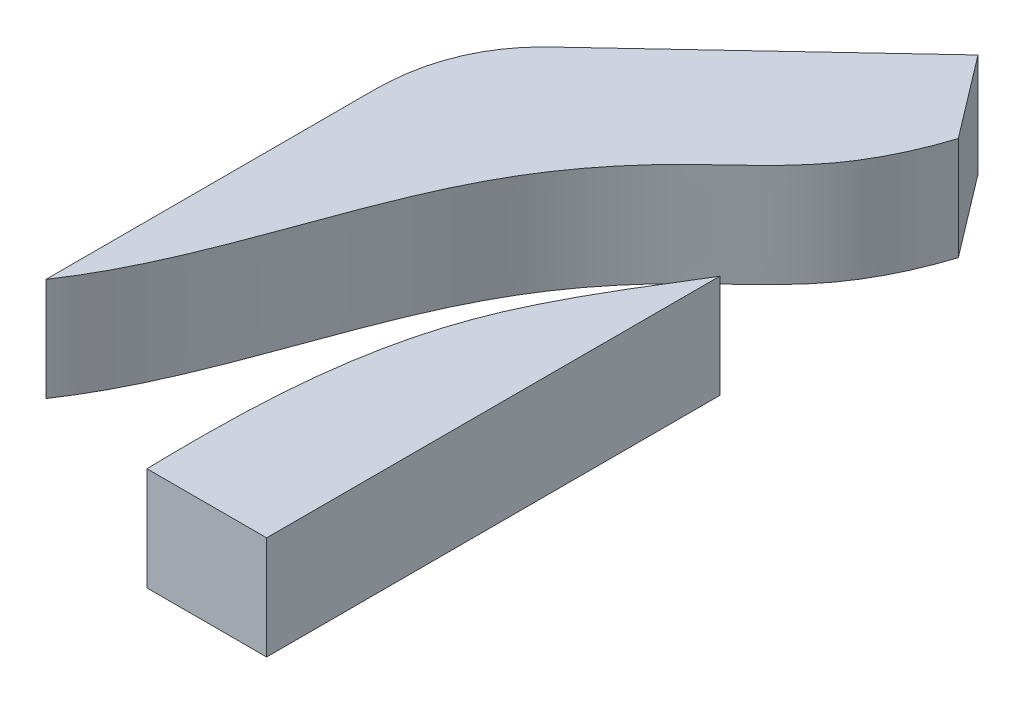
ISO-10303-21;
HEADER;
FILE_DESCRIPTION(('STEP AP214'),'2;1');
FILE_NAME('part.step','',(''),(''),'','','');
FILE_SCHEMA(('AUTOMOTIVE_DESIGN { 1 0 10303 214 1 1 1 1 }'));
ENDSEC;
DATA;
#1=APPLICATION_CONTEXT('core data for automotive mechanical design processes');
#2=APPLICATION_PROTOCOL_DEFINITION('international standard','automotive_design',2000,#1);
#3=PRODUCT_CONTEXT('',#1,'mechanical');
#4=PRODUCT('Part','Part','',(#3));
#5=PRODUCT_RELATED_PRODUCT_CATEGORY('part','',(#4));
#6=PRODUCT_DEFINITION_FORMATION('','',#4);
#7=PRODUCT_DEFINITION_CONTEXT('part definition',#1,'design');
#8=PRODUCT_DEFINITION('design','',#6,#7);
#9=PRODUCT_DEFINITION_SHAPE('','',#8);
#10=(LENGTH_UNIT() NAMED_UNIT(*) SI_UNIT(.MILLI.,.METRE.));
#11=(NAMED_UNIT(*) PLANE_ANGLE_UNIT() SI_UNIT($,.RADIAN.));
#12=(NAMED_UNIT(*) SI_UNIT($,.STERADIAN.) SOLID_ANGLE_UNIT());
#13=UNCERTAINTY_MEASURE_WITH_UNIT(LENGTH_MEASURE(1.E-05),#10,'distance_accuracy_value','');
#14=(GEOMETRIC_REPRESENTATION_CONTEXT(3) GLOBAL_UNCERTAINTY_ASSIGNED_CONTEXT((#13)) GLOBAL_UNIT_ASSIGNED_CONTEXT((#10,
#11,#12)) REPRESENTATION_CONTEXT('',''));
#15=CARTESIAN_POINT('',(0.,0.,0.));
#16=DIRECTION('',(0.,0.,1.));
#17=DIRECTION('',(1.,0.,0.));
#18=AXIS2_PLACEMENT_3D('',#15,#16,#17);
#19=CARTESIAN_POINT('',(5.43347693708701,10.,16.1487002459388));
#20=CARTESIAN_POINT('',(2.44808963674048,10.,21.0311807748737));
#21=CARTESIAN_POINT('',(-6.09922419084622,10.,34.2629090273488));
#22=CARTESIAN_POINT('',(-6.36319319711296,10.,50.6579436667892));
#23=CARTESIAN_POINT('',(-6.1594063001425,10.,60.0382290208681));
#24=B_SPLINE_CURVE_WITH_KNOTS('',3,(#19,#20,#21,#22,#23),.UNSPECIFIED.,.F.,.F.,(4,1,4),(0.,
0.373828803189006,1.),.UNSPECIFIED.);
#25=DIRECTION('',(0.,-1.,0.));
#26=VECTOR('',#25,1.);
#27=SURFACE_OF_LINEAR_EXTRUSION('',#24,#26);
#28=CARTESIAN_POINT('',(5.43347693708701,0.,16.1487002459388));
#29=CARTESIAN_POINT('',(2.44808963674048,0.,21.0311807748737));
#30=CARTESIAN_POINT('',(-6.09922419084622,0.,34.2629090273488));
#31=CARTESIAN_POINT('',(-6.36319319711296,0.,50.6579436667892));
#32=CARTESIAN_POINT('',(-6.1594063001425,0.,60.0382290208681));
#33=B_SPLINE_CURVE_WITH_KNOTS('',3,(#28,#29,#30,#31,#32),.UNSPECIFIED.,.F.,.F.,(4,1,4),(0.,
0.373828803189006,1.),.UNSPECIFIED.);
#34=CARTESIAN_POINT('',(5.43347693708701,0.,16.1487002459388));
#35=VERTEX_POINT('',#34);
#36=CARTESIAN_POINT('',(-6.1594063001425,0.,60.0382290208681));
#37=VERTEX_POINT('',#36);
#38=EDGE_CURVE('E90',#35,#37,#33,.T.);
#39=ORIENTED_EDGE('',*,*,#38,.T.);
#40=DIRECTION('',(0.,-1.,0.));
#41=VECTOR('',#40,1.);
#42=CARTESIAN_POINT('',(-6.1594063001425,10.,60.0382290208681));
#43=LINE('',#42,#41);
#44=CARTESIAN_POINT('',(-6.1594063001425,10.,60.0382290208681));
#45=VERTEX_POINT('',#44);
#46=EDGE_CURVE('E12',#45,#37,#43,.T.);
#47=ORIENTED_EDGE('',*,*,#46,.F.);
#48=CARTESIAN_POINT('',(5.43347693708701,10.,16.1487002459388));
#49=VERTEX_POINT('',#48);
#50=EDGE_CURVE('E85',#49,#45,#24,.T.);
#51=ORIENTED_EDGE('',*,*,#50,.F.);
#52=DIRECTION('',(0.,-1.,0.));
#53=VECTOR('',#52,1.);
#54=CARTESIAN_POINT('',(5.43347693708701,10.,16.1487002459388));
#55=LINE('',#54,#53);
#56=EDGE_CURVE('E91',#49,#35,#55,.T.);
#57=ORIENTED_EDGE('',*,*,#56,.T.);
#58=EDGE_LOOP('',(#39,#47,#51,#57));
#59=FACE_BOUND('',#58,.T.);
#60=ADVANCED_FACE('F43',(#59),#27,.F.);
#61=CARTESIAN_POINT('',(-6.1594063001425,10.,60.0382290208681));
#62=DIRECTION('',(0.,0.,-1.));
#63=DIRECTION('',(-1.,0.,0.));
#64=AXIS2_PLACEMENT_3D('',#61,#62,#63);
#65=PLANE('',#64);
#66=DIRECTION('',(1.,0.,0.));
#67=VECTOR('',#66,1.);
#68=CARTESIAN_POINT('',(-6.1594063001425,0.,60.0382290208681));
#69=LINE('',#68,#67);
#70=CARTESIAN_POINT('',(5.43347693708702,0.,60.0382290208681));
#71=VERTEX_POINT('',#70);
#72=EDGE_CURVE('E92',#37,#71,#69,.T.);
#73=ORIENTED_EDGE('',*,*,#72,.T.);
#74=DIRECTION('',(0.,-1.,0.));
#75=VECTOR('',#74,1.);
#76=CARTESIAN_POINT('',(5.43347693708702,10.,60.0382290208681));
#77=LINE('',#76,#75);
#78=CARTESIAN_POINT('',(5.43347693708702,10.,60.0382290208681));
#79=VERTEX_POINT('',#78);
#80=EDGE_CURVE('E52',#79,#71,#77,.T.);
#81=ORIENTED_EDGE('',*,*,#80,.F.);
#82=DIRECTION('',(1.,0.,0.));
#83=VECTOR('',#82,1.);
#84=CARTESIAN_POINT('',(-6.1594063001425,10.,60.0382290208681));
#85=LINE('',#84,#83);
#86=EDGE_CURVE('E81',#45,#79,#85,.T.);
#87=ORIENTED_EDGE('',*,*,#86,.F.);
#88=ORIENTED_EDGE('',*,*,#46,.T.);
#89=EDGE_LOOP('',(#73,#81,#87,#88));
#90=FACE_BOUND('',#89,.T.);
#91=ADVANCED_FACE('F82',(#90),#65,.F.);
#92=CARTESIAN_POINT('',(5.43347693708701,10.,16.1487002459388));
#93=DIRECTION('',(-1.,0.,0.));
#94=DIRECTION('',(0.,0.,1.));
#95=AXIS2_PLACEMENT_3D('',#92,#93,#94);
#96=PLANE('',#95);
#97=DIRECTION('',(0.,0.,-1.));
#98=VECTOR('',#97,1.);
#99=CARTESIAN_POINT('',(5.43347693708701,0.,16.1487002459388));
#100=LINE('',#99,#98);
#101=EDGE_CURVE('E73',#71,#35,#100,.T.);
#102=ORIENTED_EDGE('',*,*,#101,.T.);
#103=ORIENTED_EDGE('',*,*,#56,.F.);
#104=DIRECTION('',(0.,0.,-1.));
#105=VECTOR('',#104,1.);
#106=CARTESIAN_POINT('',(5.43347693708702,10.,60.0382290208681));
#107=LINE('',#106,#105);
#108=EDGE_CURVE('E60',#79,#49,#107,.T.);
#109=ORIENTED_EDGE('',*,*,#108,.F.);
#110=ORIENTED_EDGE('',*,*,#80,.T.);
#111=EDGE_LOOP('',(#102,#103,#109,#110));
#112=FACE_BOUND('',#111,.T.);
#113=ADVANCED_FACE('F103',(#112),#96,.F.);
#114=CARTESIAN_POINT('',(-4.47593978036184,10.,36.9557213571783));
#115=DIRECTION('',(0.,1.,0.));
#116=DIRECTION('',(0.,0.,1.));
#117=AXIS2_PLACEMENT_3D('',#114,#115,#116);
#118=PLANE('',#117);
#119=ORIENTED_EDGE('',*,*,#50,.T.);
#120=ORIENTED_EDGE('',*,*,#86,.T.);
#121=ORIENTED_EDGE('',*,*,#108,.T.);
#122=EDGE_LOOP('',(#119,#120,#121));
#123=FACE_BOUND('',#122,.T.);
#124=ADVANCED_FACE('F88',(#123),#118,.T.);
#125=CARTESIAN_POINT('',(-4.47593978036184,0.,36.9557213571783));
#126=DIRECTION('',(0.,1.,0.));
#127=DIRECTION('',(0.,0.,1.));
#128=AXIS2_PLACEMENT_3D('',#125,#126,#127);
#129=PLANE('',#128);
#130=ORIENTED_EDGE('',*,*,#38,.F.);
#131=ORIENTED_EDGE('',*,*,#101,.F.);
#132=ORIENTED_EDGE('',*,*,#72,.F.);
#133=EDGE_LOOP('',(#130,#131,#132));
#134=FACE_BOUND('',#133,.T.);
#135=ADVANCED_FACE('F110',(#134),#129,.F.);
#136=CLOSED_SHELL('',(#60,#91,#113,#124,#135));
#137=MANIFOLD_SOLID_BREP('B2',#136);
#138=CARTESIAN_POINT('',(-0.618053813941455,10.,-14.9156518952457));
#139=DIRECTION('',(0.683862883392565,0.,0.7296105514026));
#140=DIRECTION('',(0.7296105514026,0.,-0.683862883392565));
#141=AXIS2_PLACEMENT_3D('',#138,#139,#140);
#142=PLANE('',#141);
#143=DIRECTION('',(-0.7296105514026,0.,0.683862883392565));
#144=VECTOR('',#143,1.);
#145=CARTESIAN_POINT('',(-0.618053813941455,0.,-14.9156518952457));
#146=LINE('',#145,#144);
#147=CARTESIAN_POINT('',(-0.618053813941455,0.,-14.9156518952457));
#148=VERTEX_POINT('',#147);
#149=CARTESIAN_POINT('',(-21.6096220002586,0.,4.75971370799269));
#150=VERTEX_POINT('',#149);
#151=EDGE_CURVE('E265',#148,#150,#146,.T.);
#152=ORIENTED_EDGE('',*,*,#151,.T.);
#153=DIRECTION('',(0.,-1.,0.));
#154=VECTOR('',#153,1.);
#155=CARTESIAN_POINT('',(-21.6096220002586,10.,4.75971370799269));
#156=LINE('',#155,#154);
#157=CARTESIAN_POINT('',(-21.6096220002586,10.,4.75971370799269));
#158=VERTEX_POINT('',#157);
#159=EDGE_CURVE('E41',#158,#150,#156,.T.);
#160=ORIENTED_EDGE('',*,*,#159,.F.);
#161=DIRECTION('',(-0.7296105514026,0.,0.683862883392565));
#162=VECTOR('',#161,1.);
#163=CARTESIAN_POINT('',(-0.618053813941455,10.,-14.9156518952457));
#164=LINE('',#163,#162);
#165=CARTESIAN_POINT('',(-0.618053813941455,10.,-14.9156518952457));
#166=VERTEX_POINT('',#165);
#167=EDGE_CURVE('E248',#166,#158,#164,.T.);
#168=ORIENTED_EDGE('',*,*,#167,.F.);
#169=DIRECTION('',(0.,-1.,0.));
#170=VECTOR('',#169,1.);
#171=CARTESIAN_POINT('',(-0.618053813941455,10.,-14.9156518952457));
#172=LINE('',#171,#170);
#173=EDGE_CURVE('E225',#166,#148,#172,.T.);
#174=ORIENTED_EDGE('',*,*,#173,.T.);
#175=EDGE_LOOP('',(#152,#160,#168,#174));
#176=FACE_BOUND('',#175,.T.);
#177=ADVANCED_FACE('F155',(#176),#142,.F.);
#178=CARTESIAN_POINT('',(-21.6096220002586,10.,4.75971370799269));
#179=CARTESIAN_POINT('',(-26.8359828181968,10.,9.42662947041356));
#180=CARTESIAN_POINT('',(-26.9344284356281,10.,17.0455743500859));
#181=B_SPLINE_CURVE_WITH_KNOTS('',2,(#178,#179,#180),.UNSPECIFIED.,.F.,.F.,(3,3),(0.,1.),.UNSPECIFIED.);
#182=DIRECTION('',(0.,-1.,0.));
#183=VECTOR('',#182,1.);
#184=SURFACE_OF_LINEAR_EXTRUSION('',#181,#183);
#185=CARTESIAN_POINT('',(-21.6096220002586,0.,4.75971370799269));
#186=CARTESIAN_POINT('',(-26.8359828181968,0.,9.42662947041356));
#187=CARTESIAN_POINT('',(-26.9344284356281,0.,17.0455743500859));
#188=B_SPLINE_CURVE_WITH_KNOTS('',2,(#185,#186,#187),.UNSPECIFIED.,.F.,.F.,(3,3),(0.,1.),.UNSPECIFIED.);
#189=CARTESIAN_POINT('',(-26.9344284356281,0.,17.0455743500859));
#190=VERTEX_POINT('',#189);
#191=EDGE_CURVE('E264',#150,#190,#188,.T.);
#192=ORIENTED_EDGE('',*,*,#191,.T.);
#193=DIRECTION('',(0.,-1.,0.));
#194=VECTOR('',#193,1.);
#195=CARTESIAN_POINT('',(-26.9344284356281,10.,17.0455743500859));
#196=LINE('',#195,#194);
#197=CARTESIAN_POINT('',(-26.9344284356281,10.,17.0455743500859));
#198=VERTEX_POINT('',#197);
#199=EDGE_CURVE('E163',#198,#190,#196,.T.);
#200=ORIENTED_EDGE('',*,*,#199,.F.);
#201=EDGE_CURVE('E205',#158,#198,#181,.T.);
#202=ORIENTED_EDGE('',*,*,#201,.F.);
#203=ORIENTED_EDGE('',*,*,#159,.T.);
#204=EDGE_LOOP('',(#192,#200,#202,#203));
#205=FACE_BOUND('',#204,.T.);
#206=ADVANCED_FACE('F242',(#205),#184,.F.);
#207=CARTESIAN_POINT('',(-26.9344284356281,10.,17.0455743500859));
#208=DIRECTION('',(1.,0.,0.));
#209=DIRECTION('',(0.,0.,-1.));
#210=AXIS2_PLACEMENT_3D('',#207,#208,#209);
#211=PLANE('',#210);
#212=DIRECTION('',(0.,0.,1.));
#213=VECTOR('',#212,1.);
#214=CARTESIAN_POINT('',(-26.9344284356281,0.,17.0455743500859));
#215=LINE('',#214,#213);
#216=CARTESIAN_POINT('',(-26.9344284356281,0.,49.0403598017012));
#217=VERTEX_POINT('',#216);
#218=EDGE_CURVE('E220',#190,#217,#215,.T.);
#219=ORIENTED_EDGE('',*,*,#218,.T.);
#220=DIRECTION('',(0.,-1.,0.));
#221=VECTOR('',#220,1.);
#222=CARTESIAN_POINT('',(-26.9344284356281,10.,49.0403598017012));
#223=LINE('',#222,#221);
#224=CARTESIAN_POINT('',(-26.9344284356281,10.,49.0403598017012));
#225=VERTEX_POINT('',#224);
#226=EDGE_CURVE('E217',#225,#217,#223,.T.);
#227=ORIENTED_EDGE('',*,*,#226,.F.);
#228=DIRECTION('',(0.,0.,1.));
#229=VECTOR('',#228,1.);
#230=CARTESIAN_POINT('',(-26.9344284356281,10.,17.0455743500859));
#231=LINE('',#230,#229);
#232=EDGE_CURVE('E209',#198,#225,#231,.T.);
#233=ORIENTED_EDGE('',*,*,#232,.F.);
#234=ORIENTED_EDGE('',*,*,#199,.T.);
#235=EDGE_LOOP('',(#219,#227,#233,#234));
#236=FACE_BOUND('',#235,.T.);
#237=ADVANCED_FACE('F218',(#236),#211,.F.);
#238=CARTESIAN_POINT('',(-26.9344284356281,10.,49.0403598017012));
#239=CARTESIAN_POINT('',(-20.3389444877994,10.,39.2670595151407));
#240=CARTESIAN_POINT('',(-18.0784329925562,10.,23.4099198548988));
#241=CARTESIAN_POINT('',(-6.32022440820383,10.,8.59213540569394));
#242=CARTESIAN_POINT('',(1.62343273114423,10.,2.17339689320808));
#243=CARTESIAN_POINT('',(4.50466003243867,10.,-4.05678622613597));
#244=CARTESIAN_POINT('',(5.43347693708701,10.,-6.9545605398248));
#245=B_SPLINE_CURVE_WITH_KNOTS('',3,(#238,#239,#240,#241,#242,#243,#244),.UNSPECIFIED.,.F.,.F.,
(4,1,1,1,4),(0.,0.537381328145061,0.694322963995333,0.859001823298654,1.),.UNSPECIFIED.);
#246=DIRECTION('',(0.,-1.,0.));
#247=VECTOR('',#246,1.);
#248=SURFACE_OF_LINEAR_EXTRUSION('',#245,#247);
#249=CARTESIAN_POINT('',(-26.9344284356281,0.,49.0403598017012));
#250=CARTESIAN_POINT('',(-20.3389444877994,0.,39.2670595151407));
#251=CARTESIAN_POINT('',(-18.0784329925562,0.,23.4099198548988));
#252=CARTESIAN_POINT('',(-6.32022440820383,0.,8.59213540569394));
#253=CARTESIAN_POINT('',(1.62343273114423,0.,2.17339689320808));
#254=CARTESIAN_POINT('',(4.50466003243867,0.,-4.05678622613597));
#255=CARTESIAN_POINT('',(5.43347693708701,0.,-6.9545605398248));
#256=B_SPLINE_CURVE_WITH_KNOTS('',3,(#249,#250,#251,#252,#253,#254,#255),.UNSPECIFIED.,.F.,.F.,
(4,1,1,1,4),(0.,0.537381328145061,0.694322963995333,0.859001823298654,1.),.UNSPECIFIED.);
#257=CARTESIAN_POINT('',(5.43347693708701,0.,-6.9545605398248));
#258=VERTEX_POINT('',#257);
#259=EDGE_CURVE('E191',#217,#258,#256,.T.);
#260=ORIENTED_EDGE('',*,*,#259,.T.);
#261=DIRECTION('',(0.,-1.,0.));
#262=VECTOR('',#261,1.);
#263=CARTESIAN_POINT('',(5.43347693708701,10.,-6.9545605398248));
#264=LINE('',#263,#262);
#265=CARTESIAN_POINT('',(5.43347693708701,10.,-6.9545605398248));
#266=VERTEX_POINT('',#265);
#267=EDGE_CURVE('E221',#266,#258,#264,.T.);
#268=ORIENTED_EDGE('',*,*,#267,.F.);
#269=EDGE_CURVE('E213',#225,#266,#245,.T.);
#270=ORIENTED_EDGE('',*,*,#269,.F.);
#271=ORIENTED_EDGE('',*,*,#226,.T.);
#272=EDGE_LOOP('',(#260,#268,#270,#271));
#273=FACE_BOUND('',#272,.T.);
#274=ADVANCED_FACE('F223',(#273),#248,.F.);
#275=CARTESIAN_POINT('',(5.43347693708701,10.,-6.9545605398248));
#276=DIRECTION('',(-0.796109135542087,0.,0.605153075102846));
#277=DIRECTION('',(0.605153075102846,0.,0.796109135542087));
#278=AXIS2_PLACEMENT_3D('',#275,#276,#277);
#279=PLANE('',#278);
#280=DIRECTION('',(-0.605153075102846,0.,-0.796109135542087));
#281=VECTOR('',#280,1.);
#282=CARTESIAN_POINT('',(5.43347693708701,0.,-6.9545605398248));
#283=LINE('',#282,#281);
#284=EDGE_CURVE('E197',#258,#148,#283,.T.);
#285=ORIENTED_EDGE('',*,*,#284,.T.);
#286=ORIENTED_EDGE('',*,*,#173,.F.);
#287=DIRECTION('',(-0.605153075102846,0.,-0.796109135542087));
#288=VECTOR('',#287,1.);
#289=CARTESIAN_POINT('',(5.43347693708701,10.,-6.9545605398248));
#290=LINE('',#289,#288);
#291=EDGE_CURVE('E171',#266,#166,#290,.T.);
#292=ORIENTED_EDGE('',*,*,#291,.F.);
#293=ORIENTED_EDGE('',*,*,#267,.T.);
#294=EDGE_LOOP('',(#285,#286,#292,#293));
#295=FACE_BOUND('',#294,.T.);
#296=ADVANCED_FACE('F239',(#295),#279,.F.);
#297=CARTESIAN_POINT('',(-25.5540040180701,10.,10.1646367497264));
#298=DIRECTION('',(0.,-1.,0.));
#299=DIRECTION('',(0.,0.,-1.));
#300=AXIS2_PLACEMENT_3D('',#297,#298,#299);
#301=PLANE('',#300);
#302=ORIENTED_EDGE('',*,*,#167,.T.);
#303=ORIENTED_EDGE('',*,*,#201,.T.);
#304=ORIENTED_EDGE('',*,*,#232,.T.);
#305=ORIENTED_EDGE('',*,*,#269,.T.);
#306=ORIENTED_EDGE('',*,*,#291,.T.);
#307=EDGE_LOOP('',(#302,#303,#304,#305,#306));
#308=FACE_BOUND('',#307,.T.);
#309=ADVANCED_FACE('F211',(#308),#301,.F.);
#310=CARTESIAN_POINT('',(-25.5540040180701,0.,10.1646367497264));
#311=DIRECTION('',(0.,-1.,0.));
#312=DIRECTION('',(0.,0.,-1.));
#313=AXIS2_PLACEMENT_3D('',#310,#311,#312);
#314=PLANE('',#313);
#315=ORIENTED_EDGE('',*,*,#151,.F.);
#316=ORIENTED_EDGE('',*,*,#284,.F.);
#317=ORIENTED_EDGE('',*,*,#259,.F.);
#318=ORIENTED_EDGE('',*,*,#218,.F.);
#319=ORIENTED_EDGE('',*,*,#191,.F.);
#320=EDGE_LOOP('',(#315,#316,#317,#318,#319));
#321=FACE_BOUND('',#320,.T.);
#322=ADVANCED_FACE('F263',(#321),#314,.T.);
#323=CLOSED_SHELL('',(#177,#206,#237,#274,#296,#309,#322));
#324=MANIFOLD_SOLID_BREP('B6',#323);
#325=ADVANCED_BREP_SHAPE_REPRESENTATION('',(#18,#137,#324),#14);
#326=SHAPE_DEFINITION_REPRESENTATION(#9,#325);
ENDSEC;
END-ISO-10303-21;
